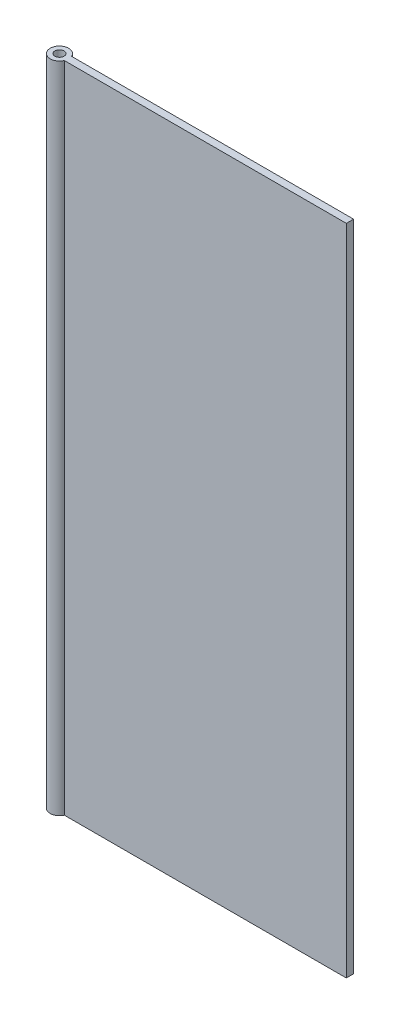
ISO-10303-21;
HEADER;
FILE_DESCRIPTION(('STEP AP214'),'2;1');
FILE_NAME('part.step','',(''),(''),'','','');
FILE_SCHEMA(('AUTOMOTIVE_DESIGN { 1 0 10303 214 1 1 1 1 }'));
ENDSEC;
DATA;
#1=APPLICATION_CONTEXT('core data for automotive mechanical design processes');
#2=APPLICATION_PROTOCOL_DEFINITION('international standard','automotive_design',2000,#1);
#3=PRODUCT_CONTEXT('',#1,'mechanical');
#4=PRODUCT('Part','Part','',(#3));
#5=PRODUCT_RELATED_PRODUCT_CATEGORY('part','',(#4));
#6=PRODUCT_DEFINITION_FORMATION('','',#4);
#7=PRODUCT_DEFINITION_CONTEXT('part definition',#1,'design');
#8=PRODUCT_DEFINITION('design','',#6,#7);
#9=PRODUCT_DEFINITION_SHAPE('','',#8);
#10=(LENGTH_UNIT() NAMED_UNIT(*) SI_UNIT(.MILLI.,.METRE.));
#11=(NAMED_UNIT(*) PLANE_ANGLE_UNIT() SI_UNIT($,.RADIAN.));
#12=(NAMED_UNIT(*) SI_UNIT($,.STERADIAN.) SOLID_ANGLE_UNIT());
#13=UNCERTAINTY_MEASURE_WITH_UNIT(LENGTH_MEASURE(1.E-05),#10,'distance_accuracy_value','');
#14=(GEOMETRIC_REPRESENTATION_CONTEXT(3) GLOBAL_UNCERTAINTY_ASSIGNED_CONTEXT((#13)) GLOBAL_UNIT_ASSIGNED_CONTEXT((#10,
#11,#12)) REPRESENTATION_CONTEXT('',''));
#15=CARTESIAN_POINT('',(0.,0.,0.));
#16=DIRECTION('',(0.,0.,1.));
#17=DIRECTION('',(1.,0.,0.));
#18=AXIS2_PLACEMENT_3D('',#15,#16,#17);
#19=CARTESIAN_POINT('',(0.,0.,2.5));
#20=DIRECTION('',(0.,0.,1.));
#21=DIRECTION('',(1.,0.,0.));
#22=AXIS2_PLACEMENT_3D('',#19,#20,#21);
#23=PLANE('',#22);
#24=DIRECTION('',(-1.,0.,0.));
#25=VECTOR('',#24,1.);
#26=CARTESIAN_POINT('',(0.,341.925373313723,2.5));
#27=LINE('',#26,#25);
#28=CARTESIAN_POINT('',(200.,341.925373313723,2.5));
#29=VERTEX_POINT('',#28);
#30=CARTESIAN_POINT('',(5.83716540796986,341.925373313723,2.5));
#31=VERTEX_POINT('',#30);
#32=EDGE_CURVE('E87',#29,#31,#27,.T.);
#33=ORIENTED_EDGE('',*,*,#32,.T.);
#34=DIRECTION('',(0.,-1.,0.));
#35=VECTOR('',#34,1.);
#36=CARTESIAN_POINT('',(5.83716540796986,359.885885555861,2.5));
#37=LINE('',#36,#35);
#38=CARTESIAN_POINT('',(5.83716540796986,-108.074626686277,2.5));
#39=VERTEX_POINT('',#38);
#40=EDGE_CURVE('E96',#31,#39,#37,.T.);
#41=ORIENTED_EDGE('',*,*,#40,.T.);
#42=DIRECTION('',(1.,0.,0.));
#43=VECTOR('',#42,1.);
#44=CARTESIAN_POINT('',(0.,-108.074626686277,2.5));
#45=LINE('',#44,#43);
#46=CARTESIAN_POINT('',(200.,-108.074626686277,2.5));
#47=VERTEX_POINT('',#46);
#48=EDGE_CURVE('E91',#39,#47,#45,.T.);
#49=ORIENTED_EDGE('',*,*,#48,.T.);
#50=DIRECTION('',(0.,1.,0.));
#51=VECTOR('',#50,1.);
#52=CARTESIAN_POINT('',(200.,341.925373313723,2.5));
#53=LINE('',#52,#51);
#54=EDGE_CURVE('E58',#47,#29,#53,.T.);
#55=ORIENTED_EDGE('',*,*,#54,.T.);
#56=EDGE_LOOP('',(#33,#41,#49,#55));
#57=FACE_BOUND('',#56,.T.);
#58=ADVANCED_FACE('F35',(#57),#23,.T.);
#59=CARTESIAN_POINT('',(0.,0.,-2.5));
#60=DIRECTION('',(0.,0.,1.));
#61=DIRECTION('',(1.,0.,0.));
#62=AXIS2_PLACEMENT_3D('',#59,#60,#61);
#63=PLANE('',#62);
#64=DIRECTION('',(0.,-1.,0.));
#65=VECTOR('',#64,1.);
#66=CARTESIAN_POINT('',(5.83716540796986,359.885885555861,-2.5));
#67=LINE('',#66,#65);
#68=CARTESIAN_POINT('',(5.83716540796986,341.925373313723,-2.5));
#69=VERTEX_POINT('',#68);
#70=CARTESIAN_POINT('',(5.83716540796986,-108.074626686277,-2.5));
#71=VERTEX_POINT('',#70);
#72=EDGE_CURVE('E11',#69,#71,#67,.T.);
#73=ORIENTED_EDGE('',*,*,#72,.F.);
#74=DIRECTION('',(-1.,0.,0.));
#75=VECTOR('',#74,1.);
#76=CARTESIAN_POINT('',(0.,341.925373313723,-2.5));
#77=LINE('',#76,#75);
#78=CARTESIAN_POINT('',(200.,341.925373313723,-2.5));
#79=VERTEX_POINT('',#78);
#80=EDGE_CURVE('E79',#79,#69,#77,.T.);
#81=ORIENTED_EDGE('',*,*,#80,.F.);
#82=DIRECTION('',(0.,1.,0.));
#83=VECTOR('',#82,1.);
#84=CARTESIAN_POINT('',(200.,341.925373313723,-2.5));
#85=LINE('',#84,#83);
#86=CARTESIAN_POINT('',(200.,-108.074626686277,-2.5));
#87=VERTEX_POINT('',#86);
#88=EDGE_CURVE('E70',#87,#79,#85,.T.);
#89=ORIENTED_EDGE('',*,*,#88,.F.);
#90=DIRECTION('',(1.,0.,0.));
#91=VECTOR('',#90,1.);
#92=CARTESIAN_POINT('',(0.,-108.074626686277,-2.5));
#93=LINE('',#92,#91);
#94=EDGE_CURVE('E80',#71,#87,#93,.T.);
#95=ORIENTED_EDGE('',*,*,#94,.F.);
#96=EDGE_LOOP('',(#73,#81,#89,#95));
#97=FACE_BOUND('',#96,.T.);
#98=ADVANCED_FACE('F90',(#97),#63,.F.);
#99=CARTESIAN_POINT('',(0.,-108.074626686277,2.5));
#100=DIRECTION('',(0.,1.,0.));
#101=DIRECTION('',(0.,0.,1.));
#102=AXIS2_PLACEMENT_3D('',#99,#100,#101);
#103=PLANE('',#102);
#104=CARTESIAN_POINT('',(0.,-108.074626686277,0.));
#105=DIRECTION('',(0.,1.,0.));
#106=DIRECTION('',(-1.,0.,0.));
#107=AXIS2_PLACEMENT_3D('',#104,#105,#106);
#108=CIRCLE('',#107,3.17499999999993);
#109=CARTESIAN_POINT('',(-3.17499999999999,-108.074626686277,0.));
#110=VERTEX_POINT('',#109);
#111=EDGE_CURVE('E105',#110,#110,#108,.T.);
#112=ORIENTED_EDGE('',*,*,#111,.T.);
#113=EDGE_LOOP('',(#112));
#114=FACE_BOUND('',#113,.T.);
#115=ORIENTED_EDGE('',*,*,#48,.F.);
#116=CARTESIAN_POINT('',(0.,-108.074626686277,0.));
#117=DIRECTION('',(0.,1.,0.));
#118=DIRECTION('',(0.,0.,1.));
#119=AXIS2_PLACEMENT_3D('',#116,#117,#118);
#120=CIRCLE('',#119,6.35);
#121=EDGE_CURVE('E50',#39,#71,#120,.F.);
#122=ORIENTED_EDGE('',*,*,#121,.T.);
#123=ORIENTED_EDGE('',*,*,#94,.T.);
#124=DIRECTION('',(0.,0.,-1.));
#125=VECTOR('',#124,1.);
#126=CARTESIAN_POINT('',(200.,-108.074626686277,2.5));
#127=LINE('',#126,#125);
#128=EDGE_CURVE('E43',#47,#87,#127,.T.);
#129=ORIENTED_EDGE('',*,*,#128,.F.);
#130=EDGE_LOOP('',(#115,#122,#123,#129));
#131=FACE_BOUND('',#130,.T.);
#132=ADVANCED_FACE('F37',(#114,#131),#103,.F.);
#133=CARTESIAN_POINT('',(200.,341.925373313723,2.5));
#134=DIRECTION('',(-1.,0.,0.));
#135=DIRECTION('',(0.,-1.,0.));
#136=AXIS2_PLACEMENT_3D('',#133,#134,#135);
#137=PLANE('',#136);
#138=ORIENTED_EDGE('',*,*,#88,.T.);
#139=DIRECTION('',(0.,0.,-1.));
#140=VECTOR('',#139,1.);
#141=CARTESIAN_POINT('',(200.,341.925373313723,2.5));
#142=LINE('',#141,#140);
#143=EDGE_CURVE('E73',#29,#79,#142,.T.);
#144=ORIENTED_EDGE('',*,*,#143,.F.);
#145=ORIENTED_EDGE('',*,*,#54,.F.);
#146=ORIENTED_EDGE('',*,*,#128,.T.);
#147=EDGE_LOOP('',(#138,#144,#145,#146));
#148=FACE_BOUND('',#147,.T.);
#149=ADVANCED_FACE('F72',(#148),#137,.F.);
#150=CARTESIAN_POINT('',(0.,341.925373313723,2.5));
#151=DIRECTION('',(0.,-1.,0.));
#152=DIRECTION('',(0.,0.,-1.));
#153=AXIS2_PLACEMENT_3D('',#150,#151,#152);
#154=PLANE('',#153);
#155=CARTESIAN_POINT('',(0.,341.925373313723,0.));
#156=DIRECTION('',(0.,1.,0.));
#157=DIRECTION('',(-1.,0.,0.));
#158=AXIS2_PLACEMENT_3D('',#155,#156,#157);
#159=CIRCLE('',#158,3.17499999999993);
#160=CARTESIAN_POINT('',(-3.17499999999986,341.925373313723,0.));
#161=VERTEX_POINT('',#160);
#162=EDGE_CURVE('E106',#161,#161,#159,.T.);
#163=ORIENTED_EDGE('',*,*,#162,.F.);
#164=EDGE_LOOP('',(#163));
#165=FACE_BOUND('',#164,.T.);
#166=ORIENTED_EDGE('',*,*,#80,.T.);
#167=CARTESIAN_POINT('',(0.,341.925373313723,0.));
#168=DIRECTION('',(0.,-1.,0.));
#169=DIRECTION('',(0.,0.,-1.));
#170=AXIS2_PLACEMENT_3D('',#167,#168,#169);
#171=CIRCLE('',#170,6.35);
#172=EDGE_CURVE('E101',#31,#69,#171,.T.);
#173=ORIENTED_EDGE('',*,*,#172,.F.);
#174=ORIENTED_EDGE('',*,*,#32,.F.);
#175=ORIENTED_EDGE('',*,*,#143,.T.);
#176=EDGE_LOOP('',(#166,#173,#174,#175));
#177=FACE_BOUND('',#176,.T.);
#178=ADVANCED_FACE('F84',(#165,#177),#154,.F.);
#179=CARTESIAN_POINT('',(0.,359.885885555861,0.));
#180=DIRECTION('',(0.,-1.,0.));
#181=DIRECTION('',(0.,0.,-1.));
#182=AXIS2_PLACEMENT_3D('',#179,#180,#181);
#183=CYLINDRICAL_SURFACE('',#182,6.35);
#184=ORIENTED_EDGE('',*,*,#40,.F.);
#185=ORIENTED_EDGE('',*,*,#172,.T.);
#186=ORIENTED_EDGE('',*,*,#72,.T.);
#187=ORIENTED_EDGE('',*,*,#121,.F.);
#188=EDGE_LOOP('',(#184,#185,#186,#187));
#189=FACE_BOUND('',#188,.T.);
#190=ADVANCED_FACE('F116',(#189),#183,.T.);
#191=CARTESIAN_POINT('',(0.,-108.074626686277,0.));
#192=DIRECTION('',(0.,1.,0.));
#193=DIRECTION('',(-1.,0.,0.));
#194=AXIS2_PLACEMENT_3D('',#191,#192,#193);
#195=CYLINDRICAL_SURFACE('',#194,3.17499999999993);
#196=ORIENTED_EDGE('',*,*,#111,.F.);
#197=EDGE_LOOP('',(#196));
#198=FACE_BOUND('',#197,.T.);
#199=ORIENTED_EDGE('',*,*,#162,.T.);
#200=EDGE_LOOP('',(#199));
#201=FACE_BOUND('',#200,.T.);
#202=ADVANCED_FACE('F113',(#198,#201),#195,.F.);
#203=CLOSED_SHELL('',(#58,#98,#132,#149,#178,#190,#202));
#204=MANIFOLD_SOLID_BREP('B2',#203);
#205=ADVANCED_BREP_SHAPE_REPRESENTATION('',(#18,#204),#14);
#206=SHAPE_DEFINITION_REPRESENTATION(#9,#205);
ENDSEC;
END-ISO-10303-21;
